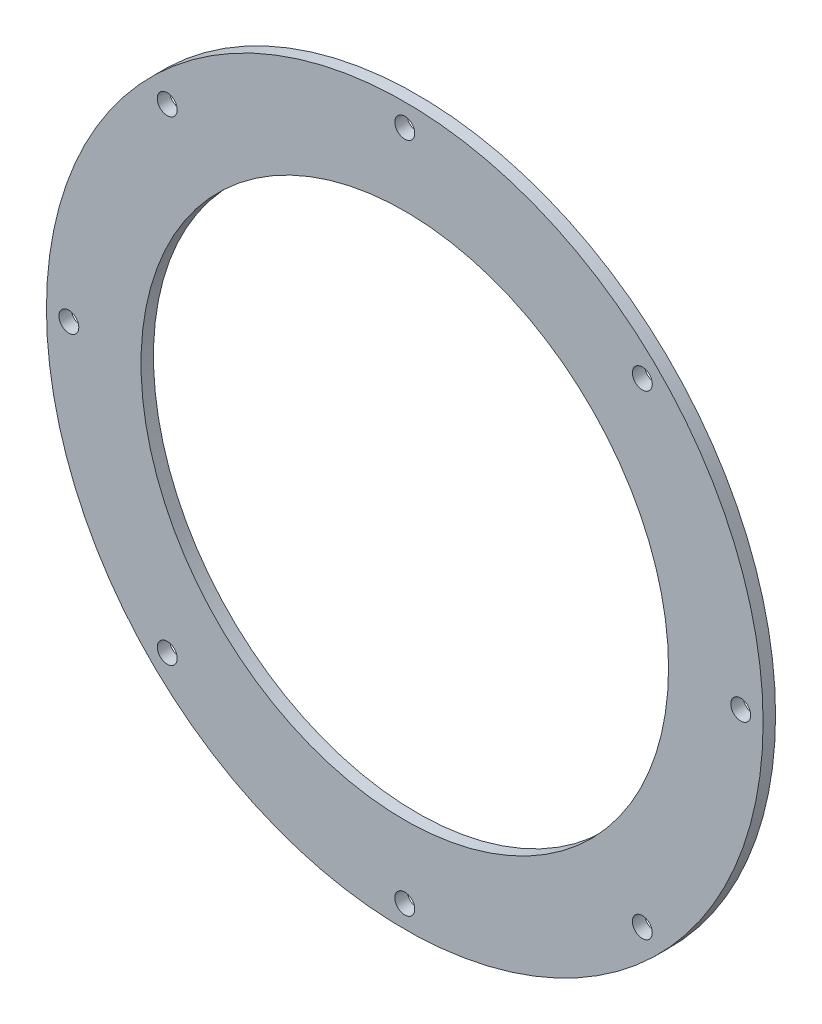
ISO-10303-21;
HEADER;
FILE_DESCRIPTION(('STEP AP214'),'2;1');
FILE_NAME('part.step','',(''),(''),'','','');
FILE_SCHEMA(('AUTOMOTIVE_DESIGN { 1 0 10303 214 1 1 1 1 }'));
ENDSEC;
DATA;
#1=APPLICATION_CONTEXT('core data for automotive mechanical design processes');
#2=APPLICATION_PROTOCOL_DEFINITION('international standard','automotive_design',2000,#1);
#3=PRODUCT_CONTEXT('',#1,'mechanical');
#4=PRODUCT('Part','Part','',(#3));
#5=PRODUCT_RELATED_PRODUCT_CATEGORY('part','',(#4));
#6=PRODUCT_DEFINITION_FORMATION('','',#4);
#7=PRODUCT_DEFINITION_CONTEXT('part definition',#1,'design');
#8=PRODUCT_DEFINITION('design','',#6,#7);
#9=PRODUCT_DEFINITION_SHAPE('','',#8);
#10=(LENGTH_UNIT() NAMED_UNIT(*) SI_UNIT(.MILLI.,.METRE.));
#11=(NAMED_UNIT(*) PLANE_ANGLE_UNIT() SI_UNIT($,.RADIAN.));
#12=(NAMED_UNIT(*) SI_UNIT($,.STERADIAN.) SOLID_ANGLE_UNIT());
#13=UNCERTAINTY_MEASURE_WITH_UNIT(LENGTH_MEASURE(1.E-05),#10,'distance_accuracy_value','');
#14=(GEOMETRIC_REPRESENTATION_CONTEXT(3) GLOBAL_UNCERTAINTY_ASSIGNED_CONTEXT((#13)) GLOBAL_UNIT_ASSIGNED_CONTEXT((#10,
#11,#12)) REPRESENTATION_CONTEXT('',''));
#15=CARTESIAN_POINT('',(0.,0.,0.));
#16=DIRECTION('',(0.,0.,1.));
#17=DIRECTION('',(1.,0.,0.));
#18=AXIS2_PLACEMENT_3D('',#15,#16,#17);
#19=CARTESIAN_POINT('',(0.,0.,2.5));
#20=DIRECTION('',(0.,0.,1.));
#21=DIRECTION('',(1.,0.,0.));
#22=AXIS2_PLACEMENT_3D('',#19,#20,#21);
#23=PLANE('',#22);
#24=CARTESIAN_POINT('',(67.5,0.,2.5));
#25=DIRECTION('',(0.,0.,1.));
#26=DIRECTION('',(1.,0.,0.));
#27=AXIS2_PLACEMENT_3D('',#24,#25,#26);
#28=CIRCLE('',#27,2.);
#29=CARTESIAN_POINT('',(69.5,0.,2.5));
#30=VERTEX_POINT('',#29);
#31=EDGE_CURVE('E104',#30,#30,#28,.T.);
#32=ORIENTED_EDGE('',*,*,#31,.F.);
#33=EDGE_LOOP('',(#32));
#34=FACE_BOUND('',#33,.T.);
#35=CARTESIAN_POINT('',(0.,67.5,2.5));
#36=DIRECTION('',(0.,0.,1.));
#37=DIRECTION('',(1.,0.,0.));
#38=AXIS2_PLACEMENT_3D('',#35,#36,#37);
#39=CIRCLE('',#38,2.);
#40=CARTESIAN_POINT('',(2.,67.5,2.5));
#41=VERTEX_POINT('',#40);
#42=EDGE_CURVE('E88',#41,#41,#39,.T.);
#43=ORIENTED_EDGE('',*,*,#42,.F.);
#44=EDGE_LOOP('',(#43));
#45=FACE_BOUND('',#44,.T.);
#46=CARTESIAN_POINT('',(-67.5,0.,2.5));
#47=DIRECTION('',(0.,0.,1.));
#48=DIRECTION('',(1.,0.,0.));
#49=AXIS2_PLACEMENT_3D('',#46,#47,#48);
#50=CIRCLE('',#49,2.);
#51=CARTESIAN_POINT('',(-65.5,0.,2.5));
#52=VERTEX_POINT('',#51);
#53=EDGE_CURVE('E72',#52,#52,#50,.T.);
#54=ORIENTED_EDGE('',*,*,#53,.F.);
#55=EDGE_LOOP('',(#54));
#56=FACE_BOUND('',#55,.T.);
#57=CARTESIAN_POINT('',(0.,0.,2.5));
#58=DIRECTION('',(0.,0.,1.));
#59=DIRECTION('',(1.,0.,0.));
#60=AXIS2_PLACEMENT_3D('',#57,#58,#59);
#61=CIRCLE('',#60,53.);
#62=CARTESIAN_POINT('',(53.,0.,2.5));
#63=VERTEX_POINT('',#62);
#64=EDGE_CURVE('E56',#63,#63,#61,.T.);
#65=ORIENTED_EDGE('',*,*,#64,.F.);
#66=EDGE_LOOP('',(#65));
#67=FACE_BOUND('',#66,.T.);
#68=CARTESIAN_POINT('',(0.,0.,2.5));
#69=DIRECTION('',(0.,0.,1.));
#70=DIRECTION('',(1.,0.,0.));
#71=AXIS2_PLACEMENT_3D('',#68,#69,#70);
#72=CIRCLE('',#71,72.);
#73=CARTESIAN_POINT('',(72.,0.,2.5));
#74=VERTEX_POINT('',#73);
#75=EDGE_CURVE('E10',#74,#74,#72,.T.);
#76=ORIENTED_EDGE('',*,*,#75,.T.);
#77=EDGE_LOOP('',(#76));
#78=FACE_BOUND('',#77,.T.);
#79=CARTESIAN_POINT('',(0.,-67.5,2.5));
#80=DIRECTION('',(0.,0.,1.));
#81=DIRECTION('',(1.,0.,0.));
#82=AXIS2_PLACEMENT_3D('',#79,#80,#81);
#83=CIRCLE('',#82,2.);
#84=CARTESIAN_POINT('',(2.,-67.5,2.5));
#85=VERTEX_POINT('',#84);
#86=EDGE_CURVE('E50',#85,#85,#83,.T.);
#87=ORIENTED_EDGE('',*,*,#86,.F.);
#88=EDGE_LOOP('',(#87));
#89=FACE_BOUND('',#88,.T.);
#90=CARTESIAN_POINT('',(-47.729707730092,-47.729707730092,2.5));
#91=DIRECTION('',(0.,0.,1.));
#92=DIRECTION('',(1.,0.,0.));
#93=AXIS2_PLACEMENT_3D('',#90,#91,#92);
#94=CIRCLE('',#93,2.);
#95=CARTESIAN_POINT('',(-45.729707730092,-47.729707730092,2.5));
#96=VERTEX_POINT('',#95);
#97=EDGE_CURVE('E64',#96,#96,#94,.T.);
#98=ORIENTED_EDGE('',*,*,#97,.F.);
#99=EDGE_LOOP('',(#98));
#100=FACE_BOUND('',#99,.T.);
#101=CARTESIAN_POINT('',(-47.729707730092,47.729707730092,2.5));
#102=DIRECTION('',(0.,0.,1.));
#103=DIRECTION('',(1.,0.,0.));
#104=AXIS2_PLACEMENT_3D('',#101,#102,#103);
#105=CIRCLE('',#104,2.);
#106=CARTESIAN_POINT('',(-45.729707730092,47.729707730092,2.5));
#107=VERTEX_POINT('',#106);
#108=EDGE_CURVE('E80',#107,#107,#105,.T.);
#109=ORIENTED_EDGE('',*,*,#108,.F.);
#110=EDGE_LOOP('',(#109));
#111=FACE_BOUND('',#110,.T.);
#112=CARTESIAN_POINT('',(47.729707730092,47.729707730092,2.5));
#113=DIRECTION('',(0.,0.,1.));
#114=DIRECTION('',(1.,0.,0.));
#115=AXIS2_PLACEMENT_3D('',#112,#113,#114);
#116=CIRCLE('',#115,2.);
#117=CARTESIAN_POINT('',(49.729707730092,47.729707730092,2.5));
#118=VERTEX_POINT('',#117);
#119=EDGE_CURVE('E96',#118,#118,#116,.T.);
#120=ORIENTED_EDGE('',*,*,#119,.F.);
#121=EDGE_LOOP('',(#120));
#122=FACE_BOUND('',#121,.T.);
#123=CARTESIAN_POINT('',(47.729707730092,-47.729707730092,2.5));
#124=DIRECTION('',(0.,0.,1.));
#125=DIRECTION('',(1.,0.,0.));
#126=AXIS2_PLACEMENT_3D('',#123,#124,#125);
#127=CIRCLE('',#126,2.);
#128=CARTESIAN_POINT('',(49.729707730092,-47.729707730092,2.5));
#129=VERTEX_POINT('',#128);
#130=EDGE_CURVE('E112',#129,#129,#127,.T.);
#131=ORIENTED_EDGE('',*,*,#130,.F.);
#132=EDGE_LOOP('',(#131));
#133=FACE_BOUND('',#132,.T.);
#134=ADVANCED_FACE('F37',(#34,#45,#56,#67,#78,#89,#100,#111,#122,#133),#23,.T.);
#135=CARTESIAN_POINT('',(0.,0.,0.));
#136=DIRECTION('',(0.,0.,1.));
#137=DIRECTION('',(1.,0.,0.));
#138=AXIS2_PLACEMENT_3D('',#135,#136,#137);
#139=PLANE('',#138);
#140=CARTESIAN_POINT('',(0.,0.,0.));
#141=DIRECTION('',(0.,0.,1.));
#142=DIRECTION('',(1.,0.,0.));
#143=AXIS2_PLACEMENT_3D('',#140,#141,#142);
#144=CIRCLE('',#143,72.);
#145=CARTESIAN_POINT('',(72.,0.,0.));
#146=VERTEX_POINT('',#145);
#147=EDGE_CURVE('E41',#146,#146,#144,.T.);
#148=ORIENTED_EDGE('',*,*,#147,.F.);
#149=EDGE_LOOP('',(#148));
#150=FACE_BOUND('',#149,.T.);
#151=CARTESIAN_POINT('',(0.,-67.5,0.));
#152=DIRECTION('',(0.,0.,1.));
#153=DIRECTION('',(1.,0.,0.));
#154=AXIS2_PLACEMENT_3D('',#151,#152,#153);
#155=CIRCLE('',#154,2.);
#156=CARTESIAN_POINT('',(2.,-67.5,0.));
#157=VERTEX_POINT('',#156);
#158=EDGE_CURVE('E52',#157,#157,#155,.T.);
#159=ORIENTED_EDGE('',*,*,#158,.T.);
#160=EDGE_LOOP('',(#159));
#161=FACE_BOUND('',#160,.T.);
#162=CARTESIAN_POINT('',(0.,0.,0.));
#163=DIRECTION('',(0.,0.,1.));
#164=DIRECTION('',(1.,0.,0.));
#165=AXIS2_PLACEMENT_3D('',#162,#163,#164);
#166=CIRCLE('',#165,53.);
#167=CARTESIAN_POINT('',(53.,0.,0.));
#168=VERTEX_POINT('',#167);
#169=EDGE_CURVE('E60',#168,#168,#166,.T.);
#170=ORIENTED_EDGE('',*,*,#169,.T.);
#171=EDGE_LOOP('',(#170));
#172=FACE_BOUND('',#171,.T.);
#173=CARTESIAN_POINT('',(-47.729707730092,-47.729707730092,0.));
#174=DIRECTION('',(0.,0.,1.));
#175=DIRECTION('',(1.,0.,0.));
#176=AXIS2_PLACEMENT_3D('',#173,#174,#175);
#177=CIRCLE('',#176,2.);
#178=CARTESIAN_POINT('',(-45.729707730092,-47.729707730092,0.));
#179=VERTEX_POINT('',#178);
#180=EDGE_CURVE('E68',#179,#179,#177,.T.);
#181=ORIENTED_EDGE('',*,*,#180,.T.);
#182=EDGE_LOOP('',(#181));
#183=FACE_BOUND('',#182,.T.);
#184=CARTESIAN_POINT('',(-67.5,0.,0.));
#185=DIRECTION('',(0.,0.,1.));
#186=DIRECTION('',(1.,0.,0.));
#187=AXIS2_PLACEMENT_3D('',#184,#185,#186);
#188=CIRCLE('',#187,2.);
#189=CARTESIAN_POINT('',(-65.5,0.,0.));
#190=VERTEX_POINT('',#189);
#191=EDGE_CURVE('E76',#190,#190,#188,.T.);
#192=ORIENTED_EDGE('',*,*,#191,.T.);
#193=EDGE_LOOP('',(#192));
#194=FACE_BOUND('',#193,.T.);
#195=CARTESIAN_POINT('',(-47.729707730092,47.729707730092,0.));
#196=DIRECTION('',(0.,0.,1.));
#197=DIRECTION('',(1.,0.,0.));
#198=AXIS2_PLACEMENT_3D('',#195,#196,#197);
#199=CIRCLE('',#198,2.);
#200=CARTESIAN_POINT('',(-45.729707730092,47.729707730092,0.));
#201=VERTEX_POINT('',#200);
#202=EDGE_CURVE('E84',#201,#201,#199,.T.);
#203=ORIENTED_EDGE('',*,*,#202,.T.);
#204=EDGE_LOOP('',(#203));
#205=FACE_BOUND('',#204,.T.);
#206=CARTESIAN_POINT('',(0.,67.5,0.));
#207=DIRECTION('',(0.,0.,1.));
#208=DIRECTION('',(1.,0.,0.));
#209=AXIS2_PLACEMENT_3D('',#206,#207,#208);
#210=CIRCLE('',#209,2.);
#211=CARTESIAN_POINT('',(2.,67.5,0.));
#212=VERTEX_POINT('',#211);
#213=EDGE_CURVE('E92',#212,#212,#210,.T.);
#214=ORIENTED_EDGE('',*,*,#213,.T.);
#215=EDGE_LOOP('',(#214));
#216=FACE_BOUND('',#215,.T.);
#217=CARTESIAN_POINT('',(47.729707730092,47.729707730092,0.));
#218=DIRECTION('',(0.,0.,1.));
#219=DIRECTION('',(1.,0.,0.));
#220=AXIS2_PLACEMENT_3D('',#217,#218,#219);
#221=CIRCLE('',#220,2.);
#222=CARTESIAN_POINT('',(49.729707730092,47.729707730092,0.));
#223=VERTEX_POINT('',#222);
#224=EDGE_CURVE('E100',#223,#223,#221,.T.);
#225=ORIENTED_EDGE('',*,*,#224,.T.);
#226=EDGE_LOOP('',(#225));
#227=FACE_BOUND('',#226,.T.);
#228=CARTESIAN_POINT('',(67.5,0.,0.));
#229=DIRECTION('',(0.,0.,1.));
#230=DIRECTION('',(1.,0.,0.));
#231=AXIS2_PLACEMENT_3D('',#228,#229,#230);
#232=CIRCLE('',#231,2.);
#233=CARTESIAN_POINT('',(69.5,0.,0.));
#234=VERTEX_POINT('',#233);
#235=EDGE_CURVE('E108',#234,#234,#232,.T.);
#236=ORIENTED_EDGE('',*,*,#235,.T.);
#237=EDGE_LOOP('',(#236));
#238=FACE_BOUND('',#237,.T.);
#239=CARTESIAN_POINT('',(47.729707730092,-47.729707730092,0.));
#240=DIRECTION('',(0.,0.,1.));
#241=DIRECTION('',(1.,0.,0.));
#242=AXIS2_PLACEMENT_3D('',#239,#240,#241);
#243=CIRCLE('',#242,2.);
#244=CARTESIAN_POINT('',(49.729707730092,-47.729707730092,0.));
#245=VERTEX_POINT('',#244);
#246=EDGE_CURVE('E116',#245,#245,#243,.T.);
#247=ORIENTED_EDGE('',*,*,#246,.T.);
#248=EDGE_LOOP('',(#247));
#249=FACE_BOUND('',#248,.T.);
#250=ADVANCED_FACE('F128',(#150,#161,#172,#183,#194,#205,#216,#227,#238,#249),#139,.F.);
#251=CARTESIAN_POINT('',(0.,0.,2.5));
#252=DIRECTION('',(0.,0.,-1.));
#253=DIRECTION('',(-1.,0.,0.));
#254=AXIS2_PLACEMENT_3D('',#251,#252,#253);
#255=CYLINDRICAL_SURFACE('',#254,72.);
#256=ORIENTED_EDGE('',*,*,#75,.F.);
#257=EDGE_LOOP('',(#256));
#258=FACE_BOUND('',#257,.T.);
#259=ORIENTED_EDGE('',*,*,#147,.T.);
#260=EDGE_LOOP('',(#259));
#261=FACE_BOUND('',#260,.T.);
#262=ADVANCED_FACE('F39',(#258,#261),#255,.T.);
#263=CARTESIAN_POINT('',(0.,-67.5,2.5));
#264=DIRECTION('',(0.,0.,-1.));
#265=DIRECTION('',(-1.,0.,0.));
#266=AXIS2_PLACEMENT_3D('',#263,#264,#265);
#267=CYLINDRICAL_SURFACE('',#266,2.);
#268=ORIENTED_EDGE('',*,*,#86,.T.);
#269=EDGE_LOOP('',(#268));
#270=FACE_BOUND('',#269,.T.);
#271=ORIENTED_EDGE('',*,*,#158,.F.);
#272=EDGE_LOOP('',(#271));
#273=FACE_BOUND('',#272,.T.);
#274=ADVANCED_FACE('F138',(#270,#273),#267,.F.);
#275=CARTESIAN_POINT('',(0.,0.,2.5));
#276=DIRECTION('',(0.,0.,-1.));
#277=DIRECTION('',(-1.,0.,0.));
#278=AXIS2_PLACEMENT_3D('',#275,#276,#277);
#279=CYLINDRICAL_SURFACE('',#278,53.);
#280=ORIENTED_EDGE('',*,*,#64,.T.);
#281=EDGE_LOOP('',(#280));
#282=FACE_BOUND('',#281,.T.);
#283=ORIENTED_EDGE('',*,*,#169,.F.);
#284=EDGE_LOOP('',(#283));
#285=FACE_BOUND('',#284,.T.);
#286=ADVANCED_FACE('F141',(#282,#285),#279,.F.);
#287=CARTESIAN_POINT('',(-47.729707730092,-47.729707730092,2.5));
#288=DIRECTION('',(0.,0.,-1.));
#289=DIRECTION('',(-1.,0.,0.));
#290=AXIS2_PLACEMENT_3D('',#287,#288,#289);
#291=CYLINDRICAL_SURFACE('',#290,2.);
#292=ORIENTED_EDGE('',*,*,#97,.T.);
#293=EDGE_LOOP('',(#292));
#294=FACE_BOUND('',#293,.T.);
#295=ORIENTED_EDGE('',*,*,#180,.F.);
#296=EDGE_LOOP('',(#295));
#297=FACE_BOUND('',#296,.T.);
#298=ADVANCED_FACE('F145',(#294,#297),#291,.F.);
#299=CARTESIAN_POINT('',(-67.5,0.,2.5));
#300=DIRECTION('',(0.,0.,-1.));
#301=DIRECTION('',(-1.,0.,0.));
#302=AXIS2_PLACEMENT_3D('',#299,#300,#301);
#303=CYLINDRICAL_SURFACE('',#302,2.);
#304=ORIENTED_EDGE('',*,*,#53,.T.);
#305=EDGE_LOOP('',(#304));
#306=FACE_BOUND('',#305,.T.);
#307=ORIENTED_EDGE('',*,*,#191,.F.);
#308=EDGE_LOOP('',(#307));
#309=FACE_BOUND('',#308,.T.);
#310=ADVANCED_FACE('F149',(#306,#309),#303,.F.);
#311=CARTESIAN_POINT('',(-47.729707730092,47.729707730092,2.5));
#312=DIRECTION('',(0.,0.,-1.));
#313=DIRECTION('',(-1.,0.,0.));
#314=AXIS2_PLACEMENT_3D('',#311,#312,#313);
#315=CYLINDRICAL_SURFACE('',#314,2.);
#316=ORIENTED_EDGE('',*,*,#108,.T.);
#317=EDGE_LOOP('',(#316));
#318=FACE_BOUND('',#317,.T.);
#319=ORIENTED_EDGE('',*,*,#202,.F.);
#320=EDGE_LOOP('',(#319));
#321=FACE_BOUND('',#320,.T.);
#322=ADVANCED_FACE('F153',(#318,#321),#315,.F.);
#323=CARTESIAN_POINT('',(0.,67.5,2.5));
#324=DIRECTION('',(0.,0.,-1.));
#325=DIRECTION('',(-1.,0.,0.));
#326=AXIS2_PLACEMENT_3D('',#323,#324,#325);
#327=CYLINDRICAL_SURFACE('',#326,2.);
#328=ORIENTED_EDGE('',*,*,#42,.T.);
#329=EDGE_LOOP('',(#328));
#330=FACE_BOUND('',#329,.T.);
#331=ORIENTED_EDGE('',*,*,#213,.F.);
#332=EDGE_LOOP('',(#331));
#333=FACE_BOUND('',#332,.T.);
#334=ADVANCED_FACE('F157',(#330,#333),#327,.F.);
#335=CARTESIAN_POINT('',(47.729707730092,47.729707730092,2.5));
#336=DIRECTION('',(0.,0.,-1.));
#337=DIRECTION('',(-1.,0.,0.));
#338=AXIS2_PLACEMENT_3D('',#335,#336,#337);
#339=CYLINDRICAL_SURFACE('',#338,2.);
#340=ORIENTED_EDGE('',*,*,#119,.T.);
#341=EDGE_LOOP('',(#340));
#342=FACE_BOUND('',#341,.T.);
#343=ORIENTED_EDGE('',*,*,#224,.F.);
#344=EDGE_LOOP('',(#343));
#345=FACE_BOUND('',#344,.T.);
#346=ADVANCED_FACE('F161',(#342,#345),#339,.F.);
#347=CARTESIAN_POINT('',(67.5,0.,2.5));
#348=DIRECTION('',(0.,0.,-1.));
#349=DIRECTION('',(-1.,0.,0.));
#350=AXIS2_PLACEMENT_3D('',#347,#348,#349);
#351=CYLINDRICAL_SURFACE('',#350,2.);
#352=ORIENTED_EDGE('',*,*,#31,.T.);
#353=EDGE_LOOP('',(#352));
#354=FACE_BOUND('',#353,.T.);
#355=ORIENTED_EDGE('',*,*,#235,.F.);
#356=EDGE_LOOP('',(#355));
#357=FACE_BOUND('',#356,.T.);
#358=ADVANCED_FACE('F165',(#354,#357),#351,.F.);
#359=CARTESIAN_POINT('',(47.729707730092,-47.729707730092,2.5));
#360=DIRECTION('',(0.,0.,-1.));
#361=DIRECTION('',(-1.,0.,0.));
#362=AXIS2_PLACEMENT_3D('',#359,#360,#361);
#363=CYLINDRICAL_SURFACE('',#362,2.);
#364=ORIENTED_EDGE('',*,*,#130,.T.);
#365=EDGE_LOOP('',(#364));
#366=FACE_BOUND('',#365,.T.);
#367=ORIENTED_EDGE('',*,*,#246,.F.);
#368=EDGE_LOOP('',(#367));
#369=FACE_BOUND('',#368,.T.);
#370=ADVANCED_FACE('F124',(#366,#369),#363,.F.);
#371=CLOSED_SHELL('',(#134,#250,#262,#274,#286,#298,#310,#322,#334,#346,#358,#370));
#372=MANIFOLD_SOLID_BREP('B2',#371);
#373=ADVANCED_BREP_SHAPE_REPRESENTATION('',(#18,#372),#14);
#374=SHAPE_DEFINITION_REPRESENTATION(#9,#373);
ENDSEC;
END-ISO-10303-21;
